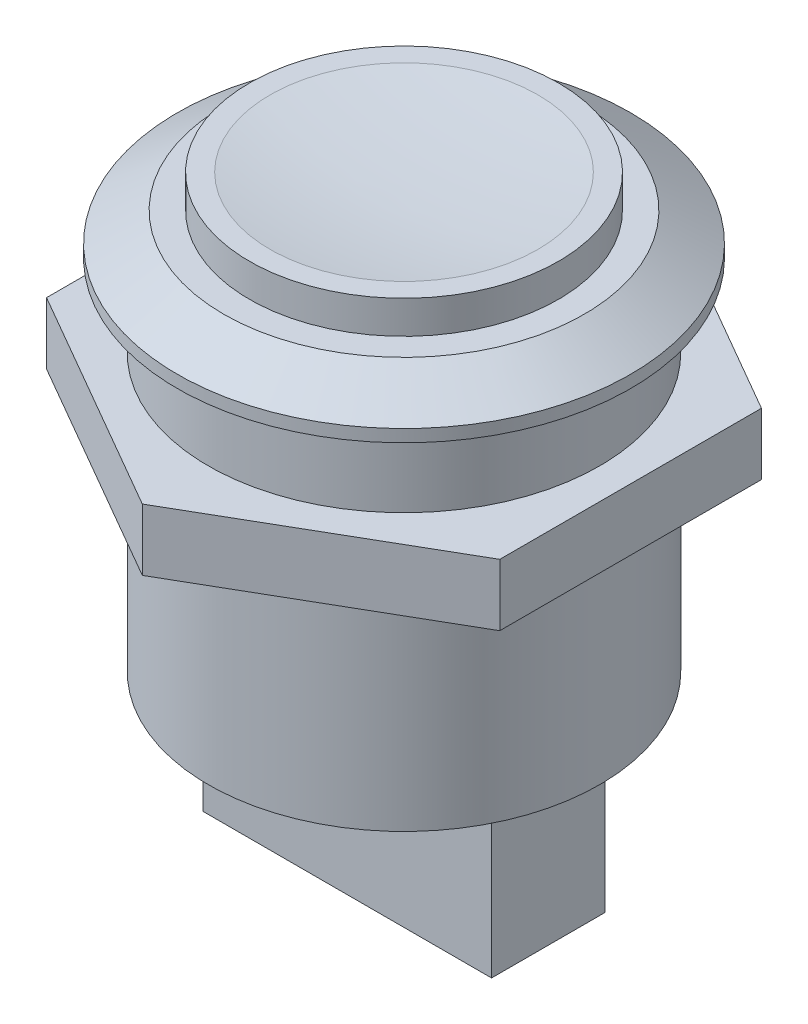
ISO-10303-21;
HEADER;
FILE_DESCRIPTION(('STEP AP214'),'2;1');
FILE_NAME('part.step','',(''),(''),'','','');
FILE_SCHEMA(('AUTOMOTIVE_DESIGN { 1 0 10303 214 1 1 1 1 }'));
ENDSEC;
DATA;
#1=APPLICATION_CONTEXT('core data for automotive mechanical design processes');
#2=APPLICATION_PROTOCOL_DEFINITION('international standard','automotive_design',2000,#1);
#3=PRODUCT_CONTEXT('',#1,'mechanical');
#4=PRODUCT('Part','Part','',(#3));
#5=PRODUCT_RELATED_PRODUCT_CATEGORY('part','',(#4));
#6=PRODUCT_DEFINITION_FORMATION('','',#4);
#7=PRODUCT_DEFINITION_CONTEXT('part definition',#1,'design');
#8=PRODUCT_DEFINITION('design','',#6,#7);
#9=PRODUCT_DEFINITION_SHAPE('','',#8);
#10=(LENGTH_UNIT() NAMED_UNIT(*) SI_UNIT(.MILLI.,.METRE.));
#11=(NAMED_UNIT(*) PLANE_ANGLE_UNIT() SI_UNIT($,.RADIAN.));
#12=(NAMED_UNIT(*) SI_UNIT($,.STERADIAN.) SOLID_ANGLE_UNIT());
#13=UNCERTAINTY_MEASURE_WITH_UNIT(LENGTH_MEASURE(1.E-05),#10,'distance_accuracy_value','');
#14=(GEOMETRIC_REPRESENTATION_CONTEXT(3) GLOBAL_UNCERTAINTY_ASSIGNED_CONTEXT((#13)) GLOBAL_UNIT_ASSIGNED_CONTEXT((#10,
#11,#12)) REPRESENTATION_CONTEXT('',''));
#15=CARTESIAN_POINT('',(0.,0.,0.));
#16=DIRECTION('',(0.,0.,1.));
#17=DIRECTION('',(1.,0.,0.));
#18=AXIS2_PLACEMENT_3D('',#15,#16,#17);
#19=CARTESIAN_POINT('',(0.,3.6,0.));
#20=DIRECTION('',(0.,-1.,0.));
#21=DIRECTION('',(0.,0.,-1.));
#22=AXIS2_PLACEMENT_3D('',#19,#20,#21);
#23=CYLINDRICAL_SURFACE('',#22,9.5);
#24=CARTESIAN_POINT('',(0.,0.,0.));
#25=DIRECTION('',(0.,-1.,0.));
#26=DIRECTION('',(0.,0.,-1.));
#27=AXIS2_PLACEMENT_3D('',#24,#25,#26);
#28=CIRCLE('',#27,9.5);
#29=CARTESIAN_POINT('',(0.,0.,-9.5));
#30=VERTEX_POINT('',#29);
#31=EDGE_CURVE('E168',#30,#30,#28,.T.);
#32=ORIENTED_EDGE('',*,*,#31,.T.);
#33=EDGE_LOOP('',(#32));
#34=FACE_BOUND('',#33,.T.);
#35=CARTESIAN_POINT('',(0.,-4.,0.));
#36=DIRECTION('',(0.,-1.,0.));
#37=DIRECTION('',(0.,0.,-1.));
#38=AXIS2_PLACEMENT_3D('',#35,#36,#37);
#39=CIRCLE('',#38,9.5);
#40=CARTESIAN_POINT('',(0.,-4.,-9.5));
#41=VERTEX_POINT('',#40);
#42=EDGE_CURVE('E133',#41,#41,#39,.F.);
#43=ORIENTED_EDGE('',*,*,#42,.T.);
#44=EDGE_LOOP('',(#43));
#45=FACE_BOUND('',#44,.T.);
#46=ADVANCED_FACE('F33',(#34,#45),#23,.T.);
#47=CARTESIAN_POINT('',(0.,45.5999999999999,0.));
#48=DIRECTION('',(0.,-1.,0.));
#49=DIRECTION('',(1.,0.,0.));
#50=AXIS2_PLACEMENT_3D('',#47,#48,#49);
#51=SPHERICAL_SURFACE('',#50,42.4999999999999);
#52=CARTESIAN_POINT('',(0.,3.6,0.));
#53=DIRECTION('',(0.,-1.,0.));
#54=DIRECTION('',(0.,0.,-1.));
#55=AXIS2_PLACEMENT_3D('',#52,#53,#54);
#56=CIRCLE('',#55,6.5);
#57=CARTESIAN_POINT('',(0.,3.6,-6.5));
#58=VERTEX_POINT('',#57);
#59=EDGE_CURVE('E186',#58,#58,#56,.T.);
#60=ORIENTED_EDGE('',*,*,#59,.F.);
#61=EDGE_LOOP('',(#60));
#62=FACE_BOUND('',#61,.T.);
#63=ADVANCED_FACE('F202',(#62),#51,.F.);
#64=CARTESIAN_POINT('',(7.5,3.6,0.));
#65=DIRECTION('',(0.,1.,0.));
#66=DIRECTION('',(0.,0.,1.));
#67=AXIS2_PLACEMENT_3D('',#64,#65,#66);
#68=PLANE('',#67);
#69=ORIENTED_EDGE('',*,*,#59,.T.);
#70=EDGE_LOOP('',(#69));
#71=FACE_BOUND('',#70,.T.);
#72=CARTESIAN_POINT('',(0.,3.6,0.));
#73=DIRECTION('',(0.,-1.,0.));
#74=DIRECTION('',(0.,0.,-1.));
#75=AXIS2_PLACEMENT_3D('',#72,#73,#74);
#76=CIRCLE('',#75,7.5);
#77=CARTESIAN_POINT('',(0.,3.6,-7.5));
#78=VERTEX_POINT('',#77);
#79=EDGE_CURVE('E183',#78,#78,#76,.T.);
#80=ORIENTED_EDGE('',*,*,#79,.F.);
#81=EDGE_LOOP('',(#80));
#82=FACE_BOUND('',#81,.T.);
#83=ADVANCED_FACE('F207',(#71,#82),#68,.T.);
#84=CARTESIAN_POINT('',(0.,3.6,0.));
#85=DIRECTION('',(0.,-1.,0.));
#86=DIRECTION('',(0.,0.,-1.));
#87=AXIS2_PLACEMENT_3D('',#84,#85,#86);
#88=CYLINDRICAL_SURFACE('',#87,7.5);
#89=ORIENTED_EDGE('',*,*,#79,.T.);
#90=EDGE_LOOP('',(#89));
#91=FACE_BOUND('',#90,.T.);
#92=CARTESIAN_POINT('',(0.,2.,0.));
#93=DIRECTION('',(0.,-1.,0.));
#94=DIRECTION('',(0.,0.,-1.));
#95=AXIS2_PLACEMENT_3D('',#92,#93,#94);
#96=CIRCLE('',#95,7.5);
#97=CARTESIAN_POINT('',(0.,2.,-7.5));
#98=VERTEX_POINT('',#97);
#99=EDGE_CURVE('E180',#98,#98,#96,.T.);
#100=ORIENTED_EDGE('',*,*,#99,.F.);
#101=EDGE_LOOP('',(#100));
#102=FACE_BOUND('',#101,.T.);
#103=ADVANCED_FACE('F306',(#91,#102),#88,.T.);
#104=CARTESIAN_POINT('',(8.75,2.,0.));
#105=DIRECTION('',(0.,1.,0.));
#106=DIRECTION('',(0.,0.,1.));
#107=AXIS2_PLACEMENT_3D('',#104,#105,#106);
#108=PLANE('',#107);
#109=ORIENTED_EDGE('',*,*,#99,.T.);
#110=EDGE_LOOP('',(#109));
#111=FACE_BOUND('',#110,.T.);
#112=CARTESIAN_POINT('',(0.,2.,0.));
#113=DIRECTION('',(0.,-1.,0.));
#114=DIRECTION('',(0.,0.,-1.));
#115=AXIS2_PLACEMENT_3D('',#112,#113,#114);
#116=CIRCLE('',#115,8.75);
#117=CARTESIAN_POINT('',(0.,2.,-8.75));
#118=VERTEX_POINT('',#117);
#119=EDGE_CURVE('E177',#118,#118,#116,.T.);
#120=ORIENTED_EDGE('',*,*,#119,.F.);
#121=EDGE_LOOP('',(#120));
#122=FACE_BOUND('',#121,.T.);
#123=ADVANCED_FACE('F302',(#111,#122),#108,.T.);
#124=CARTESIAN_POINT('',(0.,0.6,0.));
#125=DIRECTION('',(0.,-1.,0.));
#126=DIRECTION('',(0.,0.,-1.));
#127=AXIS2_PLACEMENT_3D('',#124,#125,#126);
#128=CONICAL_SURFACE('',#127,11.,1.01419700878467);
#129=ORIENTED_EDGE('',*,*,#119,.T.);
#130=EDGE_LOOP('',(#129));
#131=FACE_BOUND('',#130,.T.);
#132=CARTESIAN_POINT('',(0.,0.6,0.));
#133=DIRECTION('',(0.,-1.,0.));
#134=DIRECTION('',(0.,0.,-1.));
#135=AXIS2_PLACEMENT_3D('',#132,#133,#134);
#136=CIRCLE('',#135,11.);
#137=CARTESIAN_POINT('',(0.,0.6,-11.));
#138=VERTEX_POINT('',#137);
#139=EDGE_CURVE('E174',#138,#138,#136,.T.);
#140=ORIENTED_EDGE('',*,*,#139,.F.);
#141=EDGE_LOOP('',(#140));
#142=FACE_BOUND('',#141,.T.);
#143=ADVANCED_FACE('F298',(#131,#142),#128,.T.);
#144=CARTESIAN_POINT('',(0.,3.6,0.));
#145=DIRECTION('',(0.,-1.,0.));
#146=DIRECTION('',(0.,0.,-1.));
#147=AXIS2_PLACEMENT_3D('',#144,#145,#146);
#148=CYLINDRICAL_SURFACE('',#147,11.);
#149=ORIENTED_EDGE('',*,*,#139,.T.);
#150=EDGE_LOOP('',(#149));
#151=FACE_BOUND('',#150,.T.);
#152=CARTESIAN_POINT('',(0.,0.,0.));
#153=DIRECTION('',(0.,-1.,0.));
#154=DIRECTION('',(0.,0.,-1.));
#155=AXIS2_PLACEMENT_3D('',#152,#153,#154);
#156=CIRCLE('',#155,11.);
#157=CARTESIAN_POINT('',(0.,0.,-11.));
#158=VERTEX_POINT('',#157);
#159=EDGE_CURVE('E171',#158,#158,#156,.T.);
#160=ORIENTED_EDGE('',*,*,#159,.F.);
#161=EDGE_LOOP('',(#160));
#162=FACE_BOUND('',#161,.T.);
#163=ADVANCED_FACE('F294',(#151,#162),#148,.T.);
#164=CARTESIAN_POINT('',(9.5,0.,0.));
#165=DIRECTION('',(0.,-1.,0.));
#166=DIRECTION('',(0.,0.,-1.));
#167=AXIS2_PLACEMENT_3D('',#164,#165,#166);
#168=PLANE('',#167);
#169=ORIENTED_EDGE('',*,*,#159,.T.);
#170=EDGE_LOOP('',(#169));
#171=FACE_BOUND('',#170,.T.);
#172=ORIENTED_EDGE('',*,*,#31,.F.);
#173=EDGE_LOOP('',(#172));
#174=FACE_BOUND('',#173,.T.);
#175=ADVANCED_FACE('F273',(#171,#174),#168,.T.);
#176=CARTESIAN_POINT('',(11.,-7.,6.35085296108589));
#177=DIRECTION('',(-0.5,0.,-0.866025403784438));
#178=DIRECTION('',(-0.866025403784439,0.,0.5));
#179=AXIS2_PLACEMENT_3D('',#176,#177,#178);
#180=PLANE('',#179);
#181=DIRECTION('',(-0.866025403784439,0.,0.5));
#182=VECTOR('',#181,1.);
#183=CARTESIAN_POINT('',(11.,-4.,6.35085296108589));
#184=LINE('',#183,#182);
#185=CARTESIAN_POINT('',(11.,-4.,6.35085296108589));
#186=VERTEX_POINT('',#185);
#187=CARTESIAN_POINT('',(0.,-4.,12.7017059221718));
#188=VERTEX_POINT('',#187);
#189=EDGE_CURVE('E132',#186,#188,#184,.T.);
#190=ORIENTED_EDGE('',*,*,#189,.T.);
#191=DIRECTION('',(0.,1.,0.));
#192=VECTOR('',#191,1.);
#193=CARTESIAN_POINT('',(0.,-7.,12.7017059221718));
#194=LINE('',#193,#192);
#195=CARTESIAN_POINT('',(0.,-7.,12.7017059221718));
#196=VERTEX_POINT('',#195);
#197=EDGE_CURVE('E112',#196,#188,#194,.T.);
#198=ORIENTED_EDGE('',*,*,#197,.F.);
#199=DIRECTION('',(-0.866025403784439,0.,0.5));
#200=VECTOR('',#199,1.);
#201=CARTESIAN_POINT('',(11.,-7.,6.35085296108589));
#202=LINE('',#201,#200);
#203=CARTESIAN_POINT('',(11.,-7.,6.35085296108589));
#204=VERTEX_POINT('',#203);
#205=EDGE_CURVE('E119',#204,#196,#202,.T.);
#206=ORIENTED_EDGE('',*,*,#205,.F.);
#207=DIRECTION('',(0.,1.,0.));
#208=VECTOR('',#207,1.);
#209=CARTESIAN_POINT('',(11.,-7.,6.35085296108589));
#210=LINE('',#209,#208);
#211=EDGE_CURVE('E235',#204,#186,#210,.T.);
#212=ORIENTED_EDGE('',*,*,#211,.T.);
#213=EDGE_LOOP('',(#190,#198,#206,#212));
#214=FACE_BOUND('',#213,.T.);
#215=ADVANCED_FACE('F130',(#214),#180,.F.);
#216=CARTESIAN_POINT('',(0.,-7.,12.7017059221718));
#217=DIRECTION('',(0.5,0.,-0.866025403784439));
#218=DIRECTION('',(-0.866025403784439,0.,-0.5));
#219=AXIS2_PLACEMENT_3D('',#216,#217,#218);
#220=PLANE('',#219);
#221=DIRECTION('',(-0.866025403784439,0.,-0.5));
#222=VECTOR('',#221,1.);
#223=CARTESIAN_POINT('',(0.,-4.,12.7017059221718));
#224=LINE('',#223,#222);
#225=CARTESIAN_POINT('',(-11.,-4.,6.35085296108589));
#226=VERTEX_POINT('',#225);
#227=EDGE_CURVE('E222',#188,#226,#224,.T.);
#228=ORIENTED_EDGE('',*,*,#227,.T.);
#229=DIRECTION('',(0.,1.,0.));
#230=VECTOR('',#229,1.);
#231=CARTESIAN_POINT('',(-11.,-7.,6.35085296108589));
#232=LINE('',#231,#230);
#233=CARTESIAN_POINT('',(-11.,-7.,6.35085296108589));
#234=VERTEX_POINT('',#233);
#235=EDGE_CURVE('E115',#234,#226,#232,.T.);
#236=ORIENTED_EDGE('',*,*,#235,.F.);
#237=DIRECTION('',(-0.866025403784439,0.,-0.5));
#238=VECTOR('',#237,1.);
#239=CARTESIAN_POINT('',(0.,-7.,12.7017059221718));
#240=LINE('',#239,#238);
#241=EDGE_CURVE('E108',#196,#234,#240,.T.);
#242=ORIENTED_EDGE('',*,*,#241,.F.);
#243=ORIENTED_EDGE('',*,*,#197,.T.);
#244=EDGE_LOOP('',(#228,#236,#242,#243));
#245=FACE_BOUND('',#244,.T.);
#246=ADVANCED_FACE('F110',(#245),#220,.F.);
#247=CARTESIAN_POINT('',(-11.,-7.,6.35085296108589));
#248=DIRECTION('',(1.,0.,0.));
#249=DIRECTION('',(0.,0.,-1.));
#250=AXIS2_PLACEMENT_3D('',#247,#248,#249);
#251=PLANE('',#250);
#252=DIRECTION('',(0.,0.,-1.));
#253=VECTOR('',#252,1.);
#254=CARTESIAN_POINT('',(-11.,-4.,6.35085296108589));
#255=LINE('',#254,#253);
#256=CARTESIAN_POINT('',(-11.,-4.,-6.35085296108588));
#257=VERTEX_POINT('',#256);
#258=EDGE_CURVE('E224',#226,#257,#255,.T.);
#259=ORIENTED_EDGE('',*,*,#258,.T.);
#260=DIRECTION('',(0.,1.,0.));
#261=VECTOR('',#260,1.);
#262=CARTESIAN_POINT('',(-11.,-7.,-6.35085296108588));
#263=LINE('',#262,#261);
#264=CARTESIAN_POINT('',(-11.,-7.,-6.35085296108588));
#265=VERTEX_POINT('',#264);
#266=EDGE_CURVE('E136',#265,#257,#263,.T.);
#267=ORIENTED_EDGE('',*,*,#266,.F.);
#268=DIRECTION('',(0.,0.,-1.));
#269=VECTOR('',#268,1.);
#270=CARTESIAN_POINT('',(-11.,-7.,6.35085296108589));
#271=LINE('',#270,#269);
#272=EDGE_CURVE('E118',#234,#265,#271,.T.);
#273=ORIENTED_EDGE('',*,*,#272,.F.);
#274=ORIENTED_EDGE('',*,*,#235,.T.);
#275=EDGE_LOOP('',(#259,#267,#273,#274));
#276=FACE_BOUND('',#275,.T.);
#277=ADVANCED_FACE('F260',(#276),#251,.F.);
#278=CARTESIAN_POINT('',(-11.,-7.,-6.35085296108588));
#279=DIRECTION('',(0.5,0.,0.866025403784439));
#280=DIRECTION('',(0.866025403784439,0.,-0.5));
#281=AXIS2_PLACEMENT_3D('',#278,#279,#280);
#282=PLANE('',#281);
#283=DIRECTION('',(0.866025403784438,0.,-0.5));
#284=VECTOR('',#283,1.);
#285=CARTESIAN_POINT('',(-11.,-4.,-6.35085296108588));
#286=LINE('',#285,#284);
#287=CARTESIAN_POINT('',(0.,-4.,-12.7017059221718));
#288=VERTEX_POINT('',#287);
#289=EDGE_CURVE('E230',#257,#288,#286,.T.);
#290=ORIENTED_EDGE('',*,*,#289,.T.);
#291=DIRECTION('',(0.,1.,0.));
#292=VECTOR('',#291,1.);
#293=CARTESIAN_POINT('',(0.,-7.,-12.7017059221718));
#294=LINE('',#293,#292);
#295=CARTESIAN_POINT('',(0.,-7.,-12.7017059221718));
#296=VERTEX_POINT('',#295);
#297=EDGE_CURVE('E240',#296,#288,#294,.T.);
#298=ORIENTED_EDGE('',*,*,#297,.F.);
#299=DIRECTION('',(0.866025403784438,0.,-0.5));
#300=VECTOR('',#299,1.);
#301=CARTESIAN_POINT('',(-11.,-7.,-6.35085296108588));
#302=LINE('',#301,#300);
#303=EDGE_CURVE('E249',#265,#296,#302,.T.);
#304=ORIENTED_EDGE('',*,*,#303,.F.);
#305=ORIENTED_EDGE('',*,*,#266,.T.);
#306=EDGE_LOOP('',(#290,#298,#304,#305));
#307=FACE_BOUND('',#306,.T.);
#308=ADVANCED_FACE('F247',(#307),#282,.F.);
#309=CARTESIAN_POINT('',(0.,-7.,-12.7017059221718));
#310=DIRECTION('',(-0.5,0.,0.866025403784439));
#311=DIRECTION('',(0.866025403784439,0.,0.5));
#312=AXIS2_PLACEMENT_3D('',#309,#310,#311);
#313=PLANE('',#312);
#314=DIRECTION('',(0.866025403784439,0.,0.5));
#315=VECTOR('',#314,1.);
#316=CARTESIAN_POINT('',(0.,-4.,-12.7017059221718));
#317=LINE('',#316,#315);
#318=CARTESIAN_POINT('',(11.,-4.,-6.35085296108589));
#319=VERTEX_POINT('',#318);
#320=EDGE_CURVE('E232',#288,#319,#317,.T.);
#321=ORIENTED_EDGE('',*,*,#320,.T.);
#322=DIRECTION('',(0.,1.,0.));
#323=VECTOR('',#322,1.);
#324=CARTESIAN_POINT('',(11.,-7.,-6.35085296108589));
#325=LINE('',#324,#323);
#326=CARTESIAN_POINT('',(11.,-7.,-6.35085296108589));
#327=VERTEX_POINT('',#326);
#328=EDGE_CURVE('E237',#327,#319,#325,.T.);
#329=ORIENTED_EDGE('',*,*,#328,.F.);
#330=DIRECTION('',(0.866025403784439,0.,0.5));
#331=VECTOR('',#330,1.);
#332=CARTESIAN_POINT('',(0.,-7.,-12.7017059221718));
#333=LINE('',#332,#331);
#334=EDGE_CURVE('E257',#296,#327,#333,.T.);
#335=ORIENTED_EDGE('',*,*,#334,.F.);
#336=ORIENTED_EDGE('',*,*,#297,.T.);
#337=EDGE_LOOP('',(#321,#329,#335,#336));
#338=FACE_BOUND('',#337,.T.);
#339=ADVANCED_FACE('F253',(#338),#313,.F.);
#340=CARTESIAN_POINT('',(11.,-7.,-6.35085296108589));
#341=DIRECTION('',(-1.,0.,0.));
#342=DIRECTION('',(0.,0.,1.));
#343=AXIS2_PLACEMENT_3D('',#340,#341,#342);
#344=PLANE('',#343);
#345=DIRECTION('',(0.,0.,1.));
#346=VECTOR('',#345,1.);
#347=CARTESIAN_POINT('',(11.,-4.,-6.35085296108589));
#348=LINE('',#347,#346);
#349=EDGE_CURVE('E128',#319,#186,#348,.T.);
#350=ORIENTED_EDGE('',*,*,#349,.T.);
#351=ORIENTED_EDGE('',*,*,#211,.F.);
#352=DIRECTION('',(0.,0.,1.));
#353=VECTOR('',#352,1.);
#354=CARTESIAN_POINT('',(11.,-7.,-6.35085296108589));
#355=LINE('',#354,#353);
#356=EDGE_CURVE('E124',#327,#204,#355,.T.);
#357=ORIENTED_EDGE('',*,*,#356,.F.);
#358=ORIENTED_EDGE('',*,*,#328,.T.);
#359=EDGE_LOOP('',(#350,#351,#357,#358));
#360=FACE_BOUND('',#359,.T.);
#361=ADVANCED_FACE('F256',(#360),#344,.F.);
#362=CARTESIAN_POINT('',(0.,-7.,0.));
#363=DIRECTION('',(0.,-1.,0.));
#364=DIRECTION('',(0.,0.,-1.));
#365=AXIS2_PLACEMENT_3D('',#362,#363,#364);
#366=PLANE('',#365);
#367=CARTESIAN_POINT('',(0.,-7.,0.));
#368=DIRECTION('',(0.,-1.,0.));
#369=DIRECTION('',(0.,0.,-1.));
#370=AXIS2_PLACEMENT_3D('',#367,#368,#369);
#371=CIRCLE('',#370,9.5);
#372=CARTESIAN_POINT('',(0.,-7.,-9.5));
#373=VERTEX_POINT('',#372);
#374=EDGE_CURVE('E11',#373,#373,#371,.F.);
#375=ORIENTED_EDGE('',*,*,#374,.T.);
#376=EDGE_LOOP('',(#375));
#377=FACE_BOUND('',#376,.T.);
#378=ORIENTED_EDGE('',*,*,#205,.T.);
#379=ORIENTED_EDGE('',*,*,#241,.T.);
#380=ORIENTED_EDGE('',*,*,#272,.T.);
#381=ORIENTED_EDGE('',*,*,#303,.T.);
#382=ORIENTED_EDGE('',*,*,#334,.T.);
#383=ORIENTED_EDGE('',*,*,#356,.T.);
#384=EDGE_LOOP('',(#378,#379,#380,#381,#382,#383));
#385=FACE_BOUND('',#384,.T.);
#386=ADVANCED_FACE('F122',(#377,#385),#366,.T.);
#387=CARTESIAN_POINT('',(0.,-4.,0.));
#388=DIRECTION('',(0.,-1.,0.));
#389=DIRECTION('',(0.,0.,-1.));
#390=AXIS2_PLACEMENT_3D('',#387,#388,#389);
#391=PLANE('',#390);
#392=ORIENTED_EDGE('',*,*,#42,.F.);
#393=EDGE_LOOP('',(#392));
#394=FACE_BOUND('',#393,.T.);
#395=ORIENTED_EDGE('',*,*,#189,.F.);
#396=ORIENTED_EDGE('',*,*,#349,.F.);
#397=ORIENTED_EDGE('',*,*,#320,.F.);
#398=ORIENTED_EDGE('',*,*,#289,.F.);
#399=ORIENTED_EDGE('',*,*,#258,.F.);
#400=ORIENTED_EDGE('',*,*,#227,.F.);
#401=EDGE_LOOP('',(#395,#396,#397,#398,#399,#400));
#402=FACE_BOUND('',#401,.T.);
#403=ADVANCED_FACE('F214',(#394,#402),#391,.F.);
#404=CARTESIAN_POINT('',(0.,-25.4,0.));
#405=DIRECTION('',(0.,-1.,0.));
#406=DIRECTION('',(0.,0.,-1.));
#407=AXIS2_PLACEMENT_3D('',#404,#405,#406);
#408=PLANE('',#407);
#409=DIRECTION('',(0.,0.,1.));
#410=VECTOR('',#409,1.);
#411=CARTESIAN_POINT('',(7.,-25.4,2.75));
#412=LINE('',#411,#410);
#413=CARTESIAN_POINT('',(7.,-25.4,-2.75));
#414=VERTEX_POINT('',#413);
#415=CARTESIAN_POINT('',(7.,-25.4,2.75));
#416=VERTEX_POINT('',#415);
#417=EDGE_CURVE('E140',#414,#416,#412,.T.);
#418=ORIENTED_EDGE('',*,*,#417,.T.);
#419=DIRECTION('',(-1.,0.,0.));
#420=VECTOR('',#419,1.);
#421=CARTESIAN_POINT('',(-7.,-25.4,2.75));
#422=LINE('',#421,#420);
#423=CARTESIAN_POINT('',(-7.,-25.4,2.75));
#424=VERTEX_POINT('',#423);
#425=EDGE_CURVE('E143',#416,#424,#422,.T.);
#426=ORIENTED_EDGE('',*,*,#425,.T.);
#427=DIRECTION('',(0.,0.,-1.));
#428=VECTOR('',#427,1.);
#429=CARTESIAN_POINT('',(-7.,-25.4,2.75));
#430=LINE('',#429,#428);
#431=CARTESIAN_POINT('',(-7.,-25.4,-2.75));
#432=VERTEX_POINT('',#431);
#433=EDGE_CURVE('E145',#424,#432,#430,.T.);
#434=ORIENTED_EDGE('',*,*,#433,.T.);
#435=DIRECTION('',(1.,0.,0.));
#436=VECTOR('',#435,1.);
#437=CARTESIAN_POINT('',(-7.,-25.4,-2.75));
#438=LINE('',#437,#436);
#439=EDGE_CURVE('E147',#432,#414,#438,.T.);
#440=ORIENTED_EDGE('',*,*,#439,.T.);
#441=EDGE_LOOP('',(#418,#426,#434,#440));
#442=FACE_BOUND('',#441,.T.);
#443=ADVANCED_FACE('F217',(#442),#408,.T.);
#444=CARTESIAN_POINT('',(-7.,-25.4,2.75));
#445=DIRECTION('',(0.,0.,-1.));
#446=DIRECTION('',(-1.,0.,0.));
#447=AXIS2_PLACEMENT_3D('',#444,#445,#446);
#448=PLANE('',#447);
#449=DIRECTION('',(-1.,0.,0.));
#450=VECTOR('',#449,1.);
#451=CARTESIAN_POINT('',(-7.,-17.4,2.75));
#452=LINE('',#451,#450);
#453=CARTESIAN_POINT('',(7.,-17.4,2.75));
#454=VERTEX_POINT('',#453);
#455=CARTESIAN_POINT('',(-7.,-17.4,2.75));
#456=VERTEX_POINT('',#455);
#457=EDGE_CURVE('E151',#454,#456,#452,.T.);
#458=ORIENTED_EDGE('',*,*,#457,.T.);
#459=DIRECTION('',(0.,1.,0.));
#460=VECTOR('',#459,1.);
#461=CARTESIAN_POINT('',(-7.,-25.4,2.75));
#462=LINE('',#461,#460);
#463=EDGE_CURVE('E162',#424,#456,#462,.T.);
#464=ORIENTED_EDGE('',*,*,#463,.F.);
#465=ORIENTED_EDGE('',*,*,#425,.F.);
#466=DIRECTION('',(0.,1.,0.));
#467=VECTOR('',#466,1.);
#468=CARTESIAN_POINT('',(7.,-25.4,2.75));
#469=LINE('',#468,#467);
#470=EDGE_CURVE('E165',#416,#454,#469,.T.);
#471=ORIENTED_EDGE('',*,*,#470,.T.);
#472=EDGE_LOOP('',(#458,#464,#465,#471));
#473=FACE_BOUND('',#472,.T.);
#474=ADVANCED_FACE('F276',(#473),#448,.F.);
#475=CARTESIAN_POINT('',(-7.,-25.4,2.75));
#476=DIRECTION('',(1.,0.,0.));
#477=DIRECTION('',(0.,0.,-1.));
#478=AXIS2_PLACEMENT_3D('',#475,#476,#477);
#479=PLANE('',#478);
#480=DIRECTION('',(0.,0.,-1.));
#481=VECTOR('',#480,1.);
#482=CARTESIAN_POINT('',(-7.,-17.4,2.75));
#483=LINE('',#482,#481);
#484=CARTESIAN_POINT('',(-7.,-17.4,-2.75));
#485=VERTEX_POINT('',#484);
#486=EDGE_CURVE('E154',#456,#485,#483,.T.);
#487=ORIENTED_EDGE('',*,*,#486,.T.);
#488=DIRECTION('',(0.,1.,0.));
#489=VECTOR('',#488,1.);
#490=CARTESIAN_POINT('',(-7.,-25.4,-2.75));
#491=LINE('',#490,#489);
#492=EDGE_CURVE('E159',#432,#485,#491,.T.);
#493=ORIENTED_EDGE('',*,*,#492,.F.);
#494=ORIENTED_EDGE('',*,*,#433,.F.);
#495=ORIENTED_EDGE('',*,*,#463,.T.);
#496=EDGE_LOOP('',(#487,#493,#494,#495));
#497=FACE_BOUND('',#496,.T.);
#498=ADVANCED_FACE('F281',(#497),#479,.F.);
#499=CARTESIAN_POINT('',(-7.,-25.4,-2.75));
#500=DIRECTION('',(0.,0.,1.));
#501=DIRECTION('',(1.,0.,0.));
#502=AXIS2_PLACEMENT_3D('',#499,#500,#501);
#503=PLANE('',#502);
#504=DIRECTION('',(1.,0.,0.));
#505=VECTOR('',#504,1.);
#506=CARTESIAN_POINT('',(-7.,-17.4,-2.75));
#507=LINE('',#506,#505);
#508=CARTESIAN_POINT('',(7.,-17.4,-2.75));
#509=VERTEX_POINT('',#508);
#510=EDGE_CURVE('E52',#485,#509,#507,.T.);
#511=ORIENTED_EDGE('',*,*,#510,.T.);
#512=DIRECTION('',(0.,1.,0.));
#513=VECTOR('',#512,1.);
#514=CARTESIAN_POINT('',(7.,-25.4,-2.75));
#515=LINE('',#514,#513);
#516=EDGE_CURVE('E149',#414,#509,#515,.T.);
#517=ORIENTED_EDGE('',*,*,#516,.F.);
#518=ORIENTED_EDGE('',*,*,#439,.F.);
#519=ORIENTED_EDGE('',*,*,#492,.T.);
#520=EDGE_LOOP('',(#511,#517,#518,#519));
#521=FACE_BOUND('',#520,.T.);
#522=ADVANCED_FACE('F278',(#521),#503,.F.);
#523=CARTESIAN_POINT('',(7.,-25.4,2.75));
#524=DIRECTION('',(-1.,0.,0.));
#525=DIRECTION('',(0.,0.,1.));
#526=AXIS2_PLACEMENT_3D('',#523,#524,#525);
#527=PLANE('',#526);
#528=DIRECTION('',(0.,0.,1.));
#529=VECTOR('',#528,1.);
#530=CARTESIAN_POINT('',(7.,-17.4,2.75));
#531=LINE('',#530,#529);
#532=EDGE_CURVE('E48',#509,#454,#531,.T.);
#533=ORIENTED_EDGE('',*,*,#532,.T.);
#534=ORIENTED_EDGE('',*,*,#470,.F.);
#535=ORIENTED_EDGE('',*,*,#417,.F.);
#536=ORIENTED_EDGE('',*,*,#516,.T.);
#537=EDGE_LOOP('',(#533,#534,#535,#536));
#538=FACE_BOUND('',#537,.T.);
#539=ADVANCED_FACE('F199',(#538),#527,.F.);
#540=CARTESIAN_POINT('',(0.,-17.4,0.));
#541=DIRECTION('',(0.,-1.,0.));
#542=DIRECTION('',(0.,0.,-1.));
#543=AXIS2_PLACEMENT_3D('',#540,#541,#542);
#544=PLANE('',#543);
#545=ORIENTED_EDGE('',*,*,#532,.F.);
#546=ORIENTED_EDGE('',*,*,#510,.F.);
#547=ORIENTED_EDGE('',*,*,#486,.F.);
#548=ORIENTED_EDGE('',*,*,#457,.F.);
#549=EDGE_LOOP('',(#545,#546,#547,#548));
#550=FACE_BOUND('',#549,.T.);
#551=CARTESIAN_POINT('',(0.,-17.4,0.));
#552=DIRECTION('',(0.,-1.,0.));
#553=DIRECTION('',(0.,0.,-1.));
#554=AXIS2_PLACEMENT_3D('',#551,#552,#553);
#555=CIRCLE('',#554,9.5);
#556=CARTESIAN_POINT('',(0.,-17.4,-9.5));
#557=VERTEX_POINT('',#556);
#558=EDGE_CURVE('E41',#557,#557,#555,.T.);
#559=ORIENTED_EDGE('',*,*,#558,.T.);
#560=EDGE_LOOP('',(#559));
#561=FACE_BOUND('',#560,.T.);
#562=ADVANCED_FACE('F192',(#550,#561),#544,.T.);
#563=ORIENTED_EDGE('',*,*,#374,.F.);
#564=EDGE_LOOP('',(#563));
#565=FACE_BOUND('',#564,.T.);
#566=ORIENTED_EDGE('',*,*,#558,.F.);
#567=EDGE_LOOP('',(#566));
#568=FACE_BOUND('',#567,.T.);
#569=ADVANCED_FACE('F35',(#565,#568),#23,.T.);
#570=CLOSED_SHELL('',(#46,#63,#83,#103,#123,#143,#163,#175,#215,#246,#277,#308,#339,#361,#386,
#403,#443,#474,#498,#522,#539,#562,#569));
#571=MANIFOLD_SOLID_BREP('B2',#570);
#572=ADVANCED_BREP_SHAPE_REPRESENTATION('',(#18,#571),#14);
#573=SHAPE_DEFINITION_REPRESENTATION(#9,#572);
ENDSEC;
END-ISO-10303-21;
